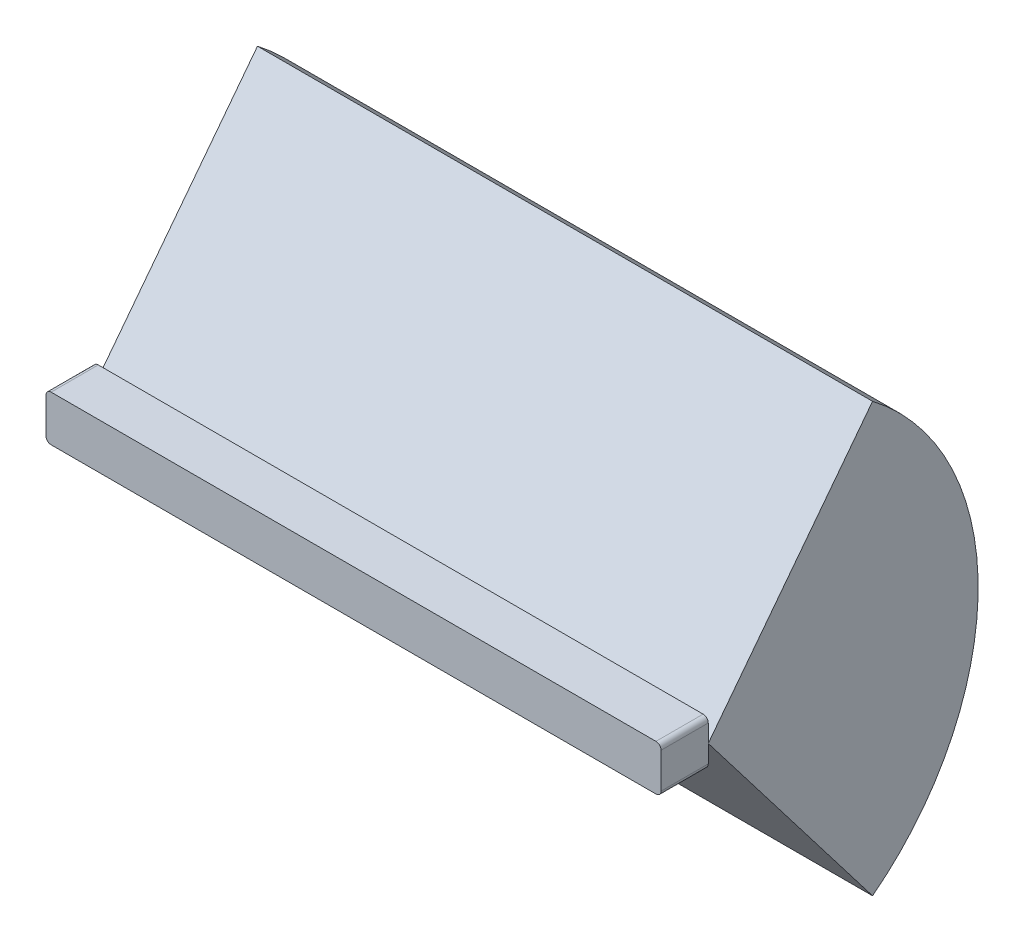
ISO-10303-21;
HEADER;
FILE_DESCRIPTION(('STEP AP214'),'2;1');
FILE_NAME('part.step','',(''),(''),'','','');
FILE_SCHEMA(('AUTOMOTIVE_DESIGN { 1 0 10303 214 1 1 1 1 }'));
ENDSEC;
DATA;
#1=APPLICATION_CONTEXT('core data for automotive mechanical design processes');
#2=APPLICATION_PROTOCOL_DEFINITION('international standard','automotive_design',2000,#1);
#3=PRODUCT_CONTEXT('',#1,'mechanical');
#4=PRODUCT('Part','Part','',(#3));
#5=PRODUCT_RELATED_PRODUCT_CATEGORY('part','',(#4));
#6=PRODUCT_DEFINITION_FORMATION('','',#4);
#7=PRODUCT_DEFINITION_CONTEXT('part definition',#1,'design');
#8=PRODUCT_DEFINITION('design','',#6,#7);
#9=PRODUCT_DEFINITION_SHAPE('','',#8);
#10=(LENGTH_UNIT() NAMED_UNIT(*) SI_UNIT(.MILLI.,.METRE.));
#11=(NAMED_UNIT(*) PLANE_ANGLE_UNIT() SI_UNIT($,.RADIAN.));
#12=(NAMED_UNIT(*) SI_UNIT($,.STERADIAN.) SOLID_ANGLE_UNIT());
#13=UNCERTAINTY_MEASURE_WITH_UNIT(LENGTH_MEASURE(1.E-05),#10,'distance_accuracy_value','');
#14=(GEOMETRIC_REPRESENTATION_CONTEXT(3) GLOBAL_UNCERTAINTY_ASSIGNED_CONTEXT((#13)) GLOBAL_UNIT_ASSIGNED_CONTEXT((#10,
#11,#12)) REPRESENTATION_CONTEXT('',''));
#15=CARTESIAN_POINT('',(0.,0.,0.));
#16=DIRECTION('',(0.,0.,1.));
#17=DIRECTION('',(1.,0.,0.));
#18=AXIS2_PLACEMENT_3D('',#15,#16,#17);
#19=CARTESIAN_POINT('',(-600.,0.,0.));
#20=DIRECTION('',(0.,-0.608761429008719,0.793353340291236));
#21=DIRECTION('',(0.,-0.793353340291237,-0.608761429008719));
#22=AXIS2_PLACEMENT_3D('',#19,#20,#21);
#23=PLANE('',#22);
#24=DIRECTION('',(0.,-0.793353340291236,-0.608761429008719));
#25=VECTOR('',#24,1.);
#26=CARTESIAN_POINT('',(600.,0.,0.));
#27=LINE('',#26,#25);
#28=CARTESIAN_POINT('',(600.,0.,0.));
#29=VERTEX_POINT('',#28);
#30=CARTESIAN_POINT('',(600.,-417.741352646021,-320.544213880126));
#31=VERTEX_POINT('',#30);
#32=EDGE_CURVE('E97',#29,#31,#27,.T.);
#33=ORIENTED_EDGE('',*,*,#32,.F.);
#34=DIRECTION('',(1.,0.,0.));
#35=VECTOR('',#34,1.);
#36=CARTESIAN_POINT('',(-600.,0.,0.));
#37=LINE('',#36,#35);
#38=CARTESIAN_POINT('',(-600.,0.,0.));
#39=VERTEX_POINT('',#38);
#40=EDGE_CURVE('E12',#39,#29,#37,.T.);
#41=ORIENTED_EDGE('',*,*,#40,.F.);
#42=DIRECTION('',(0.,-0.793353340291236,-0.608761429008719));
#43=VECTOR('',#42,1.);
#44=CARTESIAN_POINT('',(-600.,0.,0.));
#45=LINE('',#44,#43);
#46=CARTESIAN_POINT('',(-600.,-417.741352646021,-320.544213880126));
#47=VERTEX_POINT('',#46);
#48=EDGE_CURVE('E89',#39,#47,#45,.T.);
#49=ORIENTED_EDGE('',*,*,#48,.T.);
#50=DIRECTION('',(1.,0.,0.));
#51=VECTOR('',#50,1.);
#52=CARTESIAN_POINT('',(-600.,-417.741352646021,-320.544213880126));
#53=LINE('',#52,#51);
#54=EDGE_CURVE('E48',#47,#31,#53,.T.);
#55=ORIENTED_EDGE('',*,*,#54,.T.);
#56=EDGE_LOOP('',(#33,#41,#49,#55));
#57=FACE_BOUND('',#56,.T.);
#58=ADVANCED_FACE('F45',(#57),#23,.T.);
#59=CARTESIAN_POINT('',(-600.,0.,0.));
#60=DIRECTION('',(0.,0.608761429008719,0.793353340291237));
#61=DIRECTION('',(0.,-0.793353340291236,0.608761429008719));
#62=AXIS2_PLACEMENT_3D('',#59,#60,#61);
#63=PLANE('',#62);
#64=DIRECTION('',(0.,-0.793353340291236,0.608761429008719));
#65=VECTOR('',#64,1.);
#66=CARTESIAN_POINT('',(600.,0.,0.));
#67=LINE('',#66,#65);
#68=CARTESIAN_POINT('',(600.,417.741352646021,-320.544213880126));
#69=VERTEX_POINT('',#68);
#70=EDGE_CURVE('E91',#69,#29,#67,.T.);
#71=ORIENTED_EDGE('',*,*,#70,.F.);
#72=DIRECTION('',(1.,0.,0.));
#73=VECTOR('',#72,1.);
#74=CARTESIAN_POINT('',(-600.,417.741352646021,-320.544213880126));
#75=LINE('',#74,#73);
#76=CARTESIAN_POINT('',(-600.,417.741352646021,-320.544213880126));
#77=VERTEX_POINT('',#76);
#78=EDGE_CURVE('E54',#77,#69,#75,.T.);
#79=ORIENTED_EDGE('',*,*,#78,.F.);
#80=DIRECTION('',(0.,-0.793353340291236,0.608761429008719));
#81=VECTOR('',#80,1.);
#82=CARTESIAN_POINT('',(-600.,0.,0.));
#83=LINE('',#82,#81);
#84=EDGE_CURVE('E86',#77,#39,#83,.T.);
#85=ORIENTED_EDGE('',*,*,#84,.T.);
#86=ORIENTED_EDGE('',*,*,#40,.T.);
#87=EDGE_LOOP('',(#71,#79,#85,#86));
#88=FACE_BOUND('',#87,.T.);
#89=ADVANCED_FACE('F101',(#88),#63,.T.);
#90=CARTESIAN_POINT('',(-600.,0.,0.));
#91=DIRECTION('',(1.,0.,0.));
#92=DIRECTION('',(0.,0.,-1.));
#93=AXIS2_PLACEMENT_3D('',#90,#91,#92);
#94=CYLINDRICAL_SURFACE('',#93,526.551451201642);
#95=CARTESIAN_POINT('',(600.,0.,0.));
#96=DIRECTION('',(1.,0.,0.));
#97=DIRECTION('',(0.,0.,-1.));
#98=AXIS2_PLACEMENT_3D('',#95,#96,#97);
#99=CIRCLE('',#98,526.551451201642);
#100=EDGE_CURVE('E84',#31,#69,#99,.T.);
#101=ORIENTED_EDGE('',*,*,#100,.F.);
#102=ORIENTED_EDGE('',*,*,#54,.F.);
#103=CARTESIAN_POINT('',(-600.,0.,0.));
#104=DIRECTION('',(1.,0.,0.));
#105=DIRECTION('',(0.,0.,-1.));
#106=AXIS2_PLACEMENT_3D('',#103,#104,#105);
#107=CIRCLE('',#106,526.551451201642);
#108=EDGE_CURVE('E82',#47,#77,#107,.T.);
#109=ORIENTED_EDGE('',*,*,#108,.T.);
#110=ORIENTED_EDGE('',*,*,#78,.T.);
#111=EDGE_LOOP('',(#101,#102,#109,#110));
#112=FACE_BOUND('',#111,.T.);
#113=ADVANCED_FACE('F81',(#112),#94,.T.);
#114=CARTESIAN_POINT('',(-600.,0.,0.));
#115=DIRECTION('',(1.,0.,0.));
#116=DIRECTION('',(0.,0.,-1.));
#117=AXIS2_PLACEMENT_3D('',#114,#115,#116);
#118=PLANE('',#117);
#119=ORIENTED_EDGE('',*,*,#48,.F.);
#120=ORIENTED_EDGE('',*,*,#84,.F.);
#121=ORIENTED_EDGE('',*,*,#108,.F.);
#122=EDGE_LOOP('',(#119,#120,#121));
#123=FACE_BOUND('',#122,.T.);
#124=ADVANCED_FACE('F88',(#123),#118,.F.);
#125=CARTESIAN_POINT('',(600.,0.,0.));
#126=DIRECTION('',(1.,0.,0.));
#127=DIRECTION('',(0.,0.,-1.));
#128=AXIS2_PLACEMENT_3D('',#125,#126,#127);
#129=PLANE('',#128);
#130=ORIENTED_EDGE('',*,*,#32,.T.);
#131=ORIENTED_EDGE('',*,*,#100,.T.);
#132=ORIENTED_EDGE('',*,*,#70,.T.);
#133=EDGE_LOOP('',(#130,#131,#132));
#134=FACE_BOUND('',#133,.T.);
#135=ADVANCED_FACE('F100',(#134),#129,.T.);
#136=CLOSED_SHELL('',(#58,#89,#113,#124,#135));
#137=MANIFOLD_SOLID_BREP('B2',#136);
#138=CARTESIAN_POINT('',(-590.,-34.5,92.));
#139=DIRECTION('',(0.,0.,-1.));
#140=DIRECTION('',(-1.,0.,0.));
#141=AXIS2_PLACEMENT_3D('',#138,#139,#140);
#142=CYLINDRICAL_SURFACE('',#141,10.);
#143=CARTESIAN_POINT('',(-590.,-34.5,0.));
#144=DIRECTION('',(0.,0.,1.));
#145=DIRECTION('',(-1.,0.,0.));
#146=AXIS2_PLACEMENT_3D('',#143,#144,#145);
#147=CIRCLE('',#146,10.);
#148=CARTESIAN_POINT('',(-600.,-34.5,0.));
#149=VERTEX_POINT('',#148);
#150=CARTESIAN_POINT('',(-590.,-44.5,0.));
#151=VERTEX_POINT('',#150);
#152=EDGE_CURVE('E239',#149,#151,#147,.T.);
#153=ORIENTED_EDGE('',*,*,#152,.T.);
#154=DIRECTION('',(0.,0.,-1.));
#155=VECTOR('',#154,1.);
#156=CARTESIAN_POINT('',(-590.,-44.5,92.));
#157=LINE('',#156,#155);
#158=CARTESIAN_POINT('',(-590.,-44.5,92.));
#159=VERTEX_POINT('',#158);
#160=EDGE_CURVE('E43',#159,#151,#157,.T.);
#161=ORIENTED_EDGE('',*,*,#160,.F.);
#162=CARTESIAN_POINT('',(-590.,-34.5,92.));
#163=DIRECTION('',(0.,0.,1.));
#164=DIRECTION('',(-1.,0.,0.));
#165=AXIS2_PLACEMENT_3D('',#162,#163,#164);
#166=CIRCLE('',#165,10.);
#167=CARTESIAN_POINT('',(-600.,-34.5,92.));
#168=VERTEX_POINT('',#167);
#169=EDGE_CURVE('E253',#168,#159,#166,.T.);
#170=ORIENTED_EDGE('',*,*,#169,.F.);
#171=DIRECTION('',(0.,0.,-1.));
#172=VECTOR('',#171,1.);
#173=CARTESIAN_POINT('',(-600.,-34.5,92.));
#174=LINE('',#173,#172);
#175=EDGE_CURVE('E235',#168,#149,#174,.T.);
#176=ORIENTED_EDGE('',*,*,#175,.T.);
#177=EDGE_LOOP('',(#153,#161,#170,#176));
#178=FACE_BOUND('',#177,.T.);
#179=ADVANCED_FACE('F143',(#178),#142,.T.);
#180=CARTESIAN_POINT('',(-590.,-44.5,92.));
#181=DIRECTION('',(0.,1.,0.));
#182=DIRECTION('',(0.,0.,1.));
#183=AXIS2_PLACEMENT_3D('',#180,#181,#182);
#184=PLANE('',#183);
#185=DIRECTION('',(1.,0.,0.));
#186=VECTOR('',#185,1.);
#187=CARTESIAN_POINT('',(-590.,-44.5,0.));
#188=LINE('',#187,#186);
#189=CARTESIAN_POINT('',(590.,-44.5,0.));
#190=VERTEX_POINT('',#189);
#191=EDGE_CURVE('E242',#151,#190,#188,.T.);
#192=ORIENTED_EDGE('',*,*,#191,.T.);
#193=DIRECTION('',(0.,0.,-1.));
#194=VECTOR('',#193,1.);
#195=CARTESIAN_POINT('',(590.,-44.5,92.));
#196=LINE('',#195,#194);
#197=CARTESIAN_POINT('',(590.,-44.5,92.));
#198=VERTEX_POINT('',#197);
#199=EDGE_CURVE('E151',#198,#190,#196,.T.);
#200=ORIENTED_EDGE('',*,*,#199,.F.);
#201=DIRECTION('',(1.,0.,0.));
#202=VECTOR('',#201,1.);
#203=CARTESIAN_POINT('',(-590.,-44.5,92.));
#204=LINE('',#203,#202);
#205=EDGE_CURVE('E202',#159,#198,#204,.T.);
#206=ORIENTED_EDGE('',*,*,#205,.F.);
#207=ORIENTED_EDGE('',*,*,#160,.T.);
#208=EDGE_LOOP('',(#192,#200,#206,#207));
#209=FACE_BOUND('',#208,.T.);
#210=ADVANCED_FACE('F288',(#209),#184,.F.);
#211=CARTESIAN_POINT('',(590.,-34.5,92.));
#212=DIRECTION('',(0.,0.,-1.));
#213=DIRECTION('',(-1.,0.,0.));
#214=AXIS2_PLACEMENT_3D('',#211,#212,#213);
#215=CYLINDRICAL_SURFACE('',#214,10.);
#216=CARTESIAN_POINT('',(590.,-34.5,0.));
#217=DIRECTION('',(0.,0.,1.));
#218=DIRECTION('',(1.,0.,0.));
#219=AXIS2_PLACEMENT_3D('',#216,#217,#218);
#220=CIRCLE('',#219,10.);
#221=CARTESIAN_POINT('',(600.,-34.5,0.));
#222=VERTEX_POINT('',#221);
#223=EDGE_CURVE('E244',#190,#222,#220,.T.);
#224=ORIENTED_EDGE('',*,*,#223,.T.);
#225=DIRECTION('',(0.,0.,-1.));
#226=VECTOR('',#225,1.);
#227=CARTESIAN_POINT('',(600.,-34.5,92.));
#228=LINE('',#227,#226);
#229=CARTESIAN_POINT('',(600.,-34.5,92.));
#230=VERTEX_POINT('',#229);
#231=EDGE_CURVE('E260',#230,#222,#228,.T.);
#232=ORIENTED_EDGE('',*,*,#231,.F.);
#233=CARTESIAN_POINT('',(590.,-34.5,92.));
#234=DIRECTION('',(0.,0.,1.));
#235=DIRECTION('',(1.,0.,0.));
#236=AXIS2_PLACEMENT_3D('',#233,#234,#235);
#237=CIRCLE('',#236,10.);
#238=EDGE_CURVE('E268',#198,#230,#237,.T.);
#239=ORIENTED_EDGE('',*,*,#238,.F.);
#240=ORIENTED_EDGE('',*,*,#199,.T.);
#241=EDGE_LOOP('',(#224,#232,#239,#240));
#242=FACE_BOUND('',#241,.T.);
#243=ADVANCED_FACE('F266',(#242),#215,.T.);
#244=CARTESIAN_POINT('',(600.,-34.5,92.));
#245=DIRECTION('',(-1.,0.,0.));
#246=DIRECTION('',(0.,0.,1.));
#247=AXIS2_PLACEMENT_3D('',#244,#245,#246);
#248=PLANE('',#247);
#249=DIRECTION('',(0.,1.,0.));
#250=VECTOR('',#249,1.);
#251=CARTESIAN_POINT('',(600.,-34.5,0.));
#252=LINE('',#251,#250);
#253=CARTESIAN_POINT('',(600.,34.5,0.));
#254=VERTEX_POINT('',#253);
#255=EDGE_CURVE('E246',#222,#254,#252,.T.);
#256=ORIENTED_EDGE('',*,*,#255,.T.);
#257=DIRECTION('',(0.,0.,-1.));
#258=VECTOR('',#257,1.);
#259=CARTESIAN_POINT('',(600.,34.5,92.));
#260=LINE('',#259,#258);
#261=CARTESIAN_POINT('',(600.,34.5,92.));
#262=VERTEX_POINT('',#261);
#263=EDGE_CURVE('E257',#262,#254,#260,.T.);
#264=ORIENTED_EDGE('',*,*,#263,.F.);
#265=DIRECTION('',(0.,1.,0.));
#266=VECTOR('',#265,1.);
#267=CARTESIAN_POINT('',(600.,-34.5,92.));
#268=LINE('',#267,#266);
#269=EDGE_CURVE('E280',#230,#262,#268,.T.);
#270=ORIENTED_EDGE('',*,*,#269,.F.);
#271=ORIENTED_EDGE('',*,*,#231,.T.);
#272=EDGE_LOOP('',(#256,#264,#270,#271));
#273=FACE_BOUND('',#272,.T.);
#274=ADVANCED_FACE('F276',(#273),#248,.F.);
#275=CARTESIAN_POINT('',(590.,34.5,92.));
#276=DIRECTION('',(0.,0.,-1.));
#277=DIRECTION('',(-1.,0.,0.));
#278=AXIS2_PLACEMENT_3D('',#275,#276,#277);
#279=CYLINDRICAL_SURFACE('',#278,10.);
#280=CARTESIAN_POINT('',(590.,34.5,0.));
#281=DIRECTION('',(0.,0.,1.));
#282=DIRECTION('',(1.,0.,0.));
#283=AXIS2_PLACEMENT_3D('',#280,#281,#282);
#284=CIRCLE('',#283,10.);
#285=CARTESIAN_POINT('',(590.,44.5,0.));
#286=VERTEX_POINT('',#285);
#287=EDGE_CURVE('E248',#254,#286,#284,.T.);
#288=ORIENTED_EDGE('',*,*,#287,.T.);
#289=DIRECTION('',(0.,0.,-1.));
#290=VECTOR('',#289,1.);
#291=CARTESIAN_POINT('',(590.,44.5,92.));
#292=LINE('',#291,#290);
#293=CARTESIAN_POINT('',(590.,44.5,92.));
#294=VERTEX_POINT('',#293);
#295=EDGE_CURVE('E230',#294,#286,#292,.T.);
#296=ORIENTED_EDGE('',*,*,#295,.F.);
#297=CARTESIAN_POINT('',(590.,34.5,92.));
#298=DIRECTION('',(0.,0.,1.));
#299=DIRECTION('',(1.,0.,0.));
#300=AXIS2_PLACEMENT_3D('',#297,#298,#299);
#301=CIRCLE('',#300,10.);
#302=EDGE_CURVE('E221',#262,#294,#301,.T.);
#303=ORIENTED_EDGE('',*,*,#302,.F.);
#304=ORIENTED_EDGE('',*,*,#263,.T.);
#305=EDGE_LOOP('',(#288,#296,#303,#304));
#306=FACE_BOUND('',#305,.T.);
#307=ADVANCED_FACE('F279',(#306),#279,.T.);
#308=CARTESIAN_POINT('',(-590.,44.5,92.));
#309=DIRECTION('',(0.,-1.,0.));
#310=DIRECTION('',(0.,0.,-1.));
#311=AXIS2_PLACEMENT_3D('',#308,#309,#310);
#312=PLANE('',#311);
#313=DIRECTION('',(-1.,0.,0.));
#314=VECTOR('',#313,1.);
#315=CARTESIAN_POINT('',(-590.,44.5,0.));
#316=LINE('',#315,#314);
#317=CARTESIAN_POINT('',(-590.,44.5,0.));
#318=VERTEX_POINT('',#317);
#319=EDGE_CURVE('E229',#286,#318,#316,.T.);
#320=ORIENTED_EDGE('',*,*,#319,.T.);
#321=DIRECTION('',(0.,0.,-1.));
#322=VECTOR('',#321,1.);
#323=CARTESIAN_POINT('',(-590.,44.5,92.));
#324=LINE('',#323,#322);
#325=CARTESIAN_POINT('',(-590.,44.5,92.));
#326=VERTEX_POINT('',#325);
#327=EDGE_CURVE('E226',#326,#318,#324,.T.);
#328=ORIENTED_EDGE('',*,*,#327,.F.);
#329=DIRECTION('',(-1.,0.,0.));
#330=VECTOR('',#329,1.);
#331=CARTESIAN_POINT('',(-590.,44.5,92.));
#332=LINE('',#331,#330);
#333=EDGE_CURVE('E215',#294,#326,#332,.T.);
#334=ORIENTED_EDGE('',*,*,#333,.F.);
#335=ORIENTED_EDGE('',*,*,#295,.T.);
#336=EDGE_LOOP('',(#320,#328,#334,#335));
#337=FACE_BOUND('',#336,.T.);
#338=ADVANCED_FACE('F227',(#337),#312,.F.);
#339=CARTESIAN_POINT('',(-590.,34.5,92.));
#340=DIRECTION('',(0.,0.,-1.));
#341=DIRECTION('',(-1.,0.,0.));
#342=AXIS2_PLACEMENT_3D('',#339,#340,#341);
#343=CYLINDRICAL_SURFACE('',#342,10.);
#344=CARTESIAN_POINT('',(-590.,34.5,0.));
#345=DIRECTION('',(0.,0.,1.));
#346=DIRECTION('',(-1.,0.,0.));
#347=AXIS2_PLACEMENT_3D('',#344,#345,#346);
#348=CIRCLE('',#347,10.);
#349=CARTESIAN_POINT('',(-600.,34.5,0.));
#350=VERTEX_POINT('',#349);
#351=EDGE_CURVE('E188',#318,#350,#348,.T.);
#352=ORIENTED_EDGE('',*,*,#351,.T.);
#353=DIRECTION('',(0.,0.,-1.));
#354=VECTOR('',#353,1.);
#355=CARTESIAN_POINT('',(-600.,34.5,92.));
#356=LINE('',#355,#354);
#357=CARTESIAN_POINT('',(-600.,34.5,92.));
#358=VERTEX_POINT('',#357);
#359=EDGE_CURVE('E231',#358,#350,#356,.T.);
#360=ORIENTED_EDGE('',*,*,#359,.F.);
#361=CARTESIAN_POINT('',(-590.,34.5,92.));
#362=DIRECTION('',(0.,0.,1.));
#363=DIRECTION('',(-1.,0.,0.));
#364=AXIS2_PLACEMENT_3D('',#361,#362,#363);
#365=CIRCLE('',#364,10.);
#366=EDGE_CURVE('E219',#326,#358,#365,.T.);
#367=ORIENTED_EDGE('',*,*,#366,.F.);
#368=ORIENTED_EDGE('',*,*,#327,.T.);
#369=EDGE_LOOP('',(#352,#360,#367,#368));
#370=FACE_BOUND('',#369,.T.);
#371=ADVANCED_FACE('F233',(#370),#343,.T.);
#372=CARTESIAN_POINT('',(-600.,-34.5,92.));
#373=DIRECTION('',(1.,0.,0.));
#374=DIRECTION('',(0.,0.,-1.));
#375=AXIS2_PLACEMENT_3D('',#372,#373,#374);
#376=PLANE('',#375);
#377=DIRECTION('',(0.,-1.,0.));
#378=VECTOR('',#377,1.);
#379=CARTESIAN_POINT('',(-600.,-34.5,0.));
#380=LINE('',#379,#378);
#381=EDGE_CURVE('E194',#350,#149,#380,.T.);
#382=ORIENTED_EDGE('',*,*,#381,.T.);
#383=ORIENTED_EDGE('',*,*,#175,.F.);
#384=DIRECTION('',(0.,-1.,0.));
#385=VECTOR('',#384,1.);
#386=CARTESIAN_POINT('',(-600.,-34.5,92.));
#387=LINE('',#386,#385);
#388=EDGE_CURVE('E159',#358,#168,#387,.T.);
#389=ORIENTED_EDGE('',*,*,#388,.F.);
#390=ORIENTED_EDGE('',*,*,#359,.T.);
#391=EDGE_LOOP('',(#382,#383,#389,#390));
#392=FACE_BOUND('',#391,.T.);
#393=ADVANCED_FACE('F304',(#392),#376,.F.);
#394=CARTESIAN_POINT('',(-590.,-34.5,92.));
#395=DIRECTION('',(0.,0.,-1.));
#396=DIRECTION('',(-1.,0.,0.));
#397=AXIS2_PLACEMENT_3D('',#394,#395,#396);
#398=PLANE('',#397);
#399=ORIENTED_EDGE('',*,*,#169,.T.);
#400=ORIENTED_EDGE('',*,*,#205,.T.);
#401=ORIENTED_EDGE('',*,*,#238,.T.);
#402=ORIENTED_EDGE('',*,*,#269,.T.);
#403=ORIENTED_EDGE('',*,*,#302,.T.);
#404=ORIENTED_EDGE('',*,*,#333,.T.);
#405=ORIENTED_EDGE('',*,*,#366,.T.);
#406=ORIENTED_EDGE('',*,*,#388,.T.);
#407=EDGE_LOOP('',(#399,#400,#401,#402,#403,#404,#405,#406));
#408=FACE_BOUND('',#407,.T.);
#409=ADVANCED_FACE('F217',(#408),#398,.F.);
#410=CARTESIAN_POINT('',(-590.,-34.5,0.));
#411=DIRECTION('',(0.,0.,-1.));
#412=DIRECTION('',(-1.,0.,0.));
#413=AXIS2_PLACEMENT_3D('',#410,#411,#412);
#414=PLANE('',#413);
#415=ORIENTED_EDGE('',*,*,#152,.F.);
#416=ORIENTED_EDGE('',*,*,#381,.F.);
#417=ORIENTED_EDGE('',*,*,#351,.F.);
#418=ORIENTED_EDGE('',*,*,#319,.F.);
#419=ORIENTED_EDGE('',*,*,#287,.F.);
#420=ORIENTED_EDGE('',*,*,#255,.F.);
#421=ORIENTED_EDGE('',*,*,#223,.F.);
#422=ORIENTED_EDGE('',*,*,#191,.F.);
#423=EDGE_LOOP('',(#415,#416,#417,#418,#419,#420,#421,#422));
#424=FACE_BOUND('',#423,.T.);
#425=ADVANCED_FACE('F272',(#424),#414,.T.);
#426=CLOSED_SHELL('',(#179,#210,#243,#274,#307,#338,#371,#393,#409,#425));
#427=MANIFOLD_SOLID_BREP('B6',#426);
#428=ADVANCED_BREP_SHAPE_REPRESENTATION('',(#18,#137,#427),#14);
#429=SHAPE_DEFINITION_REPRESENTATION(#9,#428);
ENDSEC;
END-ISO-10303-21;
